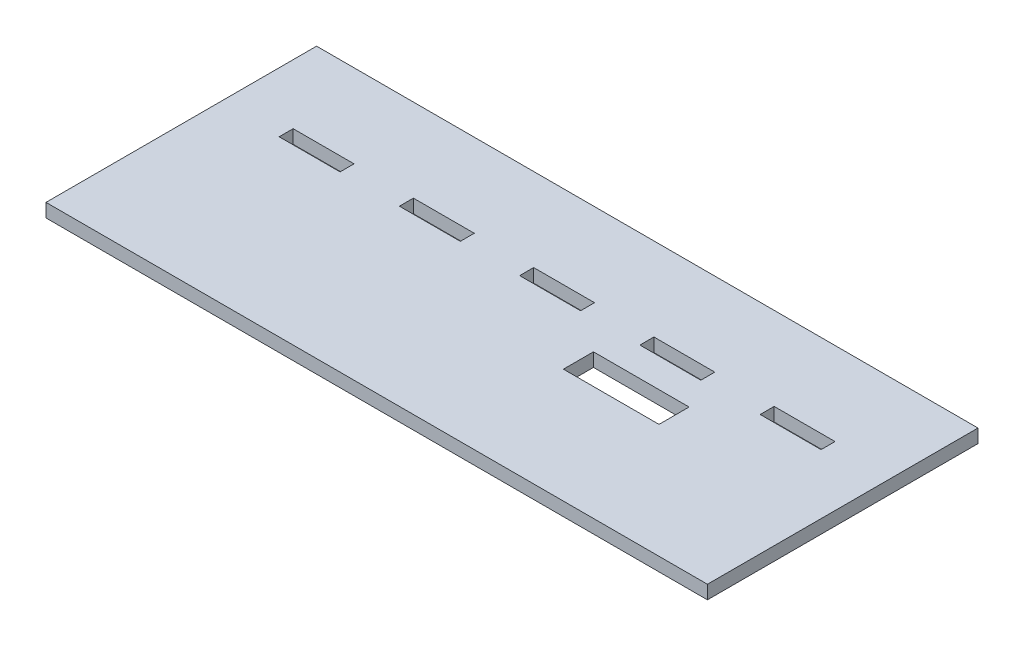
ISO-10303-21;
HEADER;
FILE_DESCRIPTION(('STEP AP214'),'2;1');
FILE_NAME('part.step','',(''),(''),'','','');
FILE_SCHEMA(('AUTOMOTIVE_DESIGN { 1 0 10303 214 1 1 1 1 }'));
ENDSEC;
DATA;
#1=APPLICATION_CONTEXT('core data for automotive mechanical design processes');
#2=APPLICATION_PROTOCOL_DEFINITION('international standard','automotive_design',2000,#1);
#3=PRODUCT_CONTEXT('',#1,'mechanical');
#4=PRODUCT('Part','Part','',(#3));
#5=PRODUCT_RELATED_PRODUCT_CATEGORY('part','',(#4));
#6=PRODUCT_DEFINITION_FORMATION('','',#4);
#7=PRODUCT_DEFINITION_CONTEXT('part definition',#1,'design');
#8=PRODUCT_DEFINITION('design','',#6,#7);
#9=PRODUCT_DEFINITION_SHAPE('','',#8);
#10=(LENGTH_UNIT() NAMED_UNIT(*) SI_UNIT(.MILLI.,.METRE.));
#11=(NAMED_UNIT(*) PLANE_ANGLE_UNIT() SI_UNIT($,.RADIAN.));
#12=(NAMED_UNIT(*) SI_UNIT($,.STERADIAN.) SOLID_ANGLE_UNIT());
#13=UNCERTAINTY_MEASURE_WITH_UNIT(LENGTH_MEASURE(1.E-05),#10,'distance_accuracy_value','');
#14=(GEOMETRIC_REPRESENTATION_CONTEXT(3) GLOBAL_UNCERTAINTY_ASSIGNED_CONTEXT((#13)) GLOBAL_UNIT_ASSIGNED_CONTEXT((#10,
#11,#12)) REPRESENTATION_CONTEXT('',''));
#15=CARTESIAN_POINT('',(0.,0.,0.));
#16=DIRECTION('',(0.,0.,1.));
#17=DIRECTION('',(1.,0.,0.));
#18=AXIS2_PLACEMENT_3D('',#15,#16,#17);
#19=CARTESIAN_POINT('',(-110.,4.5,-45.));
#20=DIRECTION('',(1.,0.,0.));
#21=DIRECTION('',(0.,0.,-1.));
#22=AXIS2_PLACEMENT_3D('',#19,#20,#21);
#23=PLANE('',#22);
#24=DIRECTION('',(0.,0.,1.));
#25=VECTOR('',#24,1.);
#26=CARTESIAN_POINT('',(-110.,0.,-45.));
#27=LINE('',#26,#25);
#28=CARTESIAN_POINT('',(-110.,0.,-45.));
#29=VERTEX_POINT('',#28);
#30=CARTESIAN_POINT('',(-110.,0.,45.));
#31=VERTEX_POINT('',#30);
#32=EDGE_CURVE('E416',#29,#31,#27,.T.);
#33=ORIENTED_EDGE('',*,*,#32,.T.);
#34=DIRECTION('',(0.,-1.,0.));
#35=VECTOR('',#34,1.);
#36=CARTESIAN_POINT('',(-110.,4.5,45.));
#37=LINE('',#36,#35);
#38=CARTESIAN_POINT('',(-110.,4.5,45.));
#39=VERTEX_POINT('',#38);
#40=EDGE_CURVE('E11',#39,#31,#37,.T.);
#41=ORIENTED_EDGE('',*,*,#40,.F.);
#42=DIRECTION('',(0.,0.,1.));
#43=VECTOR('',#42,1.);
#44=CARTESIAN_POINT('',(-110.,4.5,-45.));
#45=LINE('',#44,#43);
#46=CARTESIAN_POINT('',(-110.,4.5,-45.));
#47=VERTEX_POINT('',#46);
#48=EDGE_CURVE('E423',#47,#39,#45,.T.);
#49=ORIENTED_EDGE('',*,*,#48,.F.);
#50=DIRECTION('',(0.,-1.,0.));
#51=VECTOR('',#50,1.);
#52=CARTESIAN_POINT('',(-110.,4.5,-45.));
#53=LINE('',#52,#51);
#54=EDGE_CURVE('E433',#47,#29,#53,.T.);
#55=ORIENTED_EDGE('',*,*,#54,.T.);
#56=EDGE_LOOP('',(#33,#41,#49,#55));
#57=FACE_BOUND('',#56,.T.);
#58=ADVANCED_FACE('F42',(#57),#23,.F.);
#59=CARTESIAN_POINT('',(110.,4.5,45.));
#60=DIRECTION('',(0.,0.,-1.));
#61=DIRECTION('',(-1.,0.,0.));
#62=AXIS2_PLACEMENT_3D('',#59,#60,#61);
#63=PLANE('',#62);
#64=DIRECTION('',(1.,0.,0.));
#65=VECTOR('',#64,1.);
#66=CARTESIAN_POINT('',(110.,0.,45.));
#67=LINE('',#66,#65);
#68=CARTESIAN_POINT('',(110.,0.,45.));
#69=VERTEX_POINT('',#68);
#70=EDGE_CURVE('E436',#31,#69,#67,.T.);
#71=ORIENTED_EDGE('',*,*,#70,.T.);
#72=DIRECTION('',(0.,-1.,0.));
#73=VECTOR('',#72,1.);
#74=CARTESIAN_POINT('',(110.,4.5,45.));
#75=LINE('',#74,#73);
#76=CARTESIAN_POINT('',(110.,4.5,45.));
#77=VERTEX_POINT('',#76);
#78=EDGE_CURVE('E49',#77,#69,#75,.T.);
#79=ORIENTED_EDGE('',*,*,#78,.F.);
#80=DIRECTION('',(1.,0.,0.));
#81=VECTOR('',#80,1.);
#82=CARTESIAN_POINT('',(110.,4.5,45.));
#83=LINE('',#82,#81);
#84=EDGE_CURVE('E426',#39,#77,#83,.T.);
#85=ORIENTED_EDGE('',*,*,#84,.F.);
#86=ORIENTED_EDGE('',*,*,#40,.T.);
#87=EDGE_LOOP('',(#71,#79,#85,#86));
#88=FACE_BOUND('',#87,.T.);
#89=ADVANCED_FACE('F465',(#88),#63,.F.);
#90=CARTESIAN_POINT('',(110.,4.5,-45.));
#91=DIRECTION('',(-1.,0.,0.));
#92=DIRECTION('',(0.,0.,1.));
#93=AXIS2_PLACEMENT_3D('',#90,#91,#92);
#94=PLANE('',#93);
#95=DIRECTION('',(0.,0.,-1.));
#96=VECTOR('',#95,1.);
#97=CARTESIAN_POINT('',(110.,0.,-45.));
#98=LINE('',#97,#96);
#99=CARTESIAN_POINT('',(110.,0.,-45.));
#100=VERTEX_POINT('',#99);
#101=EDGE_CURVE('E438',#69,#100,#98,.T.);
#102=ORIENTED_EDGE('',*,*,#101,.T.);
#103=DIRECTION('',(0.,-1.,0.));
#104=VECTOR('',#103,1.);
#105=CARTESIAN_POINT('',(110.,4.5,-45.));
#106=LINE('',#105,#104);
#107=CARTESIAN_POINT('',(110.,4.5,-45.));
#108=VERTEX_POINT('',#107);
#109=EDGE_CURVE('E443',#108,#100,#106,.T.);
#110=ORIENTED_EDGE('',*,*,#109,.F.);
#111=DIRECTION('',(0.,0.,-1.));
#112=VECTOR('',#111,1.);
#113=CARTESIAN_POINT('',(110.,4.5,-45.));
#114=LINE('',#113,#112);
#115=EDGE_CURVE('E429',#77,#108,#114,.T.);
#116=ORIENTED_EDGE('',*,*,#115,.F.);
#117=ORIENTED_EDGE('',*,*,#78,.T.);
#118=EDGE_LOOP('',(#102,#110,#116,#117));
#119=FACE_BOUND('',#118,.T.);
#120=ADVANCED_FACE('F450',(#119),#94,.F.);
#121=CARTESIAN_POINT('',(110.,4.5,-45.));
#122=DIRECTION('',(0.,0.,1.));
#123=DIRECTION('',(1.,0.,0.));
#124=AXIS2_PLACEMENT_3D('',#121,#122,#123);
#125=PLANE('',#124);
#126=DIRECTION('',(-1.,0.,0.));
#127=VECTOR('',#126,1.);
#128=CARTESIAN_POINT('',(110.,0.,-45.));
#129=LINE('',#128,#127);
#130=EDGE_CURVE('E427',#100,#29,#129,.T.);
#131=ORIENTED_EDGE('',*,*,#130,.T.);
#132=ORIENTED_EDGE('',*,*,#54,.F.);
#133=DIRECTION('',(-1.,0.,0.));
#134=VECTOR('',#133,1.);
#135=CARTESIAN_POINT('',(110.,4.5,-45.));
#136=LINE('',#135,#134);
#137=EDGE_CURVE('E431',#108,#47,#136,.T.);
#138=ORIENTED_EDGE('',*,*,#137,.F.);
#139=ORIENTED_EDGE('',*,*,#109,.T.);
#140=EDGE_LOOP('',(#131,#132,#138,#139));
#141=FACE_BOUND('',#140,.T.);
#142=ADVANCED_FACE('F459',(#141),#125,.F.);
#143=CARTESIAN_POINT('',(0.,4.5,0.));
#144=DIRECTION('',(0.,-1.,0.));
#145=DIRECTION('',(0.,0.,-1.));
#146=AXIS2_PLACEMENT_3D('',#143,#144,#145);
#147=PLANE('',#146);
#148=DIRECTION('',(-1.,0.,0.));
#149=VECTOR('',#148,1.);
#150=CARTESIAN_POINT('',(55.9013875365791,4.5,7.));
#151=LINE('',#150,#149);
#152=CARTESIAN_POINT('',(55.9013875365791,4.5,7.));
#153=VERTEX_POINT('',#152);
#154=CARTESIAN_POINT('',(24.0986124634209,4.5,7.));
#155=VERTEX_POINT('',#154);
#156=EDGE_CURVE('E234',#153,#155,#151,.T.);
#157=ORIENTED_EDGE('',*,*,#156,.T.);
#158=DIRECTION('',(0.,0.,-1.));
#159=VECTOR('',#158,1.);
#160=CARTESIAN_POINT('',(24.0986124634209,4.5,7.));
#161=LINE('',#160,#159);
#162=CARTESIAN_POINT('',(24.0986124634209,4.5,-3.));
#163=VERTEX_POINT('',#162);
#164=EDGE_CURVE('E228',#155,#163,#161,.T.);
#165=ORIENTED_EDGE('',*,*,#164,.T.);
#166=DIRECTION('',(1.,0.,0.));
#167=VECTOR('',#166,1.);
#168=CARTESIAN_POINT('',(55.9013875365791,4.5,-3.));
#169=LINE('',#168,#167);
#170=CARTESIAN_POINT('',(55.9013875365791,4.5,-3.));
#171=VERTEX_POINT('',#170);
#172=EDGE_CURVE('E237',#163,#171,#169,.T.);
#173=ORIENTED_EDGE('',*,*,#172,.T.);
#174=DIRECTION('',(0.,0.,1.));
#175=VECTOR('',#174,1.);
#176=CARTESIAN_POINT('',(55.9013875365791,4.5,7.));
#177=LINE('',#176,#175);
#178=EDGE_CURVE('E56',#171,#153,#177,.T.);
#179=ORIENTED_EDGE('',*,*,#178,.T.);
#180=EDGE_LOOP('',(#157,#165,#173,#179));
#181=FACE_BOUND('',#180,.T.);
#182=DIRECTION('',(-1.,0.,0.));
#183=VECTOR('',#182,1.);
#184=CARTESIAN_POINT('',(-90.125,4.5,-12.675));
#185=LINE('',#184,#183);
#186=CARTESIAN_POINT('',(-69.875,4.5,-12.675));
#187=VERTEX_POINT('',#186);
#188=CARTESIAN_POINT('',(-90.125,4.5,-12.675));
#189=VERTEX_POINT('',#188);
#190=EDGE_CURVE('E330',#187,#189,#185,.T.);
#191=ORIENTED_EDGE('',*,*,#190,.T.);
#192=DIRECTION('',(0.,0.,-1.));
#193=VECTOR('',#192,1.);
#194=CARTESIAN_POINT('',(-90.125,4.5,-12.675));
#195=LINE('',#194,#193);
#196=CARTESIAN_POINT('',(-90.125,4.5,-17.325));
#197=VERTEX_POINT('',#196);
#198=EDGE_CURVE('E342',#189,#197,#195,.T.);
#199=ORIENTED_EDGE('',*,*,#198,.T.);
#200=DIRECTION('',(1.,0.,0.));
#201=VECTOR('',#200,1.);
#202=CARTESIAN_POINT('',(-90.125,4.5,-17.325));
#203=LINE('',#202,#201);
#204=CARTESIAN_POINT('',(-69.875,4.5,-17.325));
#205=VERTEX_POINT('',#204);
#206=EDGE_CURVE('E356',#197,#205,#203,.T.);
#207=ORIENTED_EDGE('',*,*,#206,.T.);
#208=DIRECTION('',(0.,0.,1.));
#209=VECTOR('',#208,1.);
#210=CARTESIAN_POINT('',(-69.875,4.5,-12.675));
#211=LINE('',#210,#209);
#212=EDGE_CURVE('E353',#205,#187,#211,.T.);
#213=ORIENTED_EDGE('',*,*,#212,.T.);
#214=EDGE_LOOP('',(#191,#199,#207,#213));
#215=FACE_BOUND('',#214,.T.);
#216=DIRECTION('',(0.,0.,-1.));
#217=VECTOR('',#216,1.);
#218=CARTESIAN_POINT('',(29.875,4.5,-12.675));
#219=LINE('',#218,#217);
#220=CARTESIAN_POINT('',(29.875,4.5,-12.675));
#221=VERTEX_POINT('',#220);
#222=CARTESIAN_POINT('',(29.875,4.5,-17.325));
#223=VERTEX_POINT('',#222);
#224=EDGE_CURVE('E364',#221,#223,#219,.T.);
#225=ORIENTED_EDGE('',*,*,#224,.T.);
#226=DIRECTION('',(1.,0.,0.));
#227=VECTOR('',#226,1.);
#228=CARTESIAN_POINT('',(50.125,4.5,-17.325));
#229=LINE('',#228,#227);
#230=CARTESIAN_POINT('',(50.125,4.5,-17.325));
#231=VERTEX_POINT('',#230);
#232=EDGE_CURVE('E374',#223,#231,#229,.T.);
#233=ORIENTED_EDGE('',*,*,#232,.T.);
#234=DIRECTION('',(0.,0.,1.));
#235=VECTOR('',#234,1.);
#236=CARTESIAN_POINT('',(50.125,4.5,-12.675));
#237=LINE('',#236,#235);
#238=CARTESIAN_POINT('',(50.125,4.5,-12.675));
#239=VERTEX_POINT('',#238);
#240=EDGE_CURVE('E386',#231,#239,#237,.T.);
#241=ORIENTED_EDGE('',*,*,#240,.T.);
#242=DIRECTION('',(-1.,0.,0.));
#243=VECTOR('',#242,1.);
#244=CARTESIAN_POINT('',(50.125,4.5,-12.675));
#245=LINE('',#244,#243);
#246=EDGE_CURVE('E383',#239,#221,#245,.T.);
#247=ORIENTED_EDGE('',*,*,#246,.T.);
#248=EDGE_LOOP('',(#225,#233,#241,#247));
#249=FACE_BOUND('',#248,.T.);
#250=DIRECTION('',(0.,0.,-1.));
#251=VECTOR('',#250,1.);
#252=CARTESIAN_POINT('',(69.875,4.5,-12.675));
#253=LINE('',#252,#251);
#254=CARTESIAN_POINT('',(69.875,4.5,-12.675));
#255=VERTEX_POINT('',#254);
#256=CARTESIAN_POINT('',(69.875,4.5,-17.325));
#257=VERTEX_POINT('',#256);
#258=EDGE_CURVE('E266',#255,#257,#253,.T.);
#259=ORIENTED_EDGE('',*,*,#258,.T.);
#260=DIRECTION('',(1.,0.,0.));
#261=VECTOR('',#260,1.);
#262=CARTESIAN_POINT('',(90.125,4.5,-17.325));
#263=LINE('',#262,#261);
#264=CARTESIAN_POINT('',(90.125,4.5,-17.325));
#265=VERTEX_POINT('',#264);
#266=EDGE_CURVE('E278',#257,#265,#263,.T.);
#267=ORIENTED_EDGE('',*,*,#266,.T.);
#268=DIRECTION('',(0.,0.,1.));
#269=VECTOR('',#268,1.);
#270=CARTESIAN_POINT('',(90.125,4.5,-12.675));
#271=LINE('',#270,#269);
#272=CARTESIAN_POINT('',(90.125,4.5,-12.675));
#273=VERTEX_POINT('',#272);
#274=EDGE_CURVE('E292',#265,#273,#271,.T.);
#275=ORIENTED_EDGE('',*,*,#274,.T.);
#276=DIRECTION('',(-1.,0.,0.));
#277=VECTOR('',#276,1.);
#278=CARTESIAN_POINT('',(90.125,4.5,-12.675));
#279=LINE('',#278,#277);
#280=EDGE_CURVE('E289',#273,#255,#279,.T.);
#281=ORIENTED_EDGE('',*,*,#280,.T.);
#282=EDGE_LOOP('',(#259,#267,#275,#281));
#283=FACE_BOUND('',#282,.T.);
#284=DIRECTION('',(-1.,0.,0.));
#285=VECTOR('',#284,1.);
#286=CARTESIAN_POINT('',(-50.125,4.5,-12.675));
#287=LINE('',#286,#285);
#288=CARTESIAN_POINT('',(-29.875,4.5,-12.675));
#289=VERTEX_POINT('',#288);
#290=CARTESIAN_POINT('',(-50.125,4.5,-12.675));
#291=VERTEX_POINT('',#290);
#292=EDGE_CURVE('E300',#289,#291,#287,.T.);
#293=ORIENTED_EDGE('',*,*,#292,.T.);
#294=DIRECTION('',(0.,0.,-1.));
#295=VECTOR('',#294,1.);
#296=CARTESIAN_POINT('',(-50.125,4.5,-12.675));
#297=LINE('',#296,#295);
#298=CARTESIAN_POINT('',(-50.125,4.5,-17.325));
#299=VERTEX_POINT('',#298);
#300=EDGE_CURVE('E310',#291,#299,#297,.T.);
#301=ORIENTED_EDGE('',*,*,#300,.T.);
#302=DIRECTION('',(1.,0.,0.));
#303=VECTOR('',#302,1.);
#304=CARTESIAN_POINT('',(-50.125,4.5,-17.325));
#305=LINE('',#304,#303);
#306=CARTESIAN_POINT('',(-29.875,4.5,-17.325));
#307=VERTEX_POINT('',#306);
#308=EDGE_CURVE('E322',#299,#307,#305,.T.);
#309=ORIENTED_EDGE('',*,*,#308,.T.);
#310=DIRECTION('',(0.,0.,1.));
#311=VECTOR('',#310,1.);
#312=CARTESIAN_POINT('',(-29.875,4.5,-12.675));
#313=LINE('',#312,#311);
#314=EDGE_CURVE('E319',#307,#289,#313,.T.);
#315=ORIENTED_EDGE('',*,*,#314,.T.);
#316=EDGE_LOOP('',(#293,#301,#309,#315));
#317=FACE_BOUND('',#316,.T.);
#318=DIRECTION('',(-1.,0.,0.));
#319=VECTOR('',#318,1.);
#320=CARTESIAN_POINT('',(10.125,4.5,-12.675));
#321=LINE('',#320,#319);
#322=CARTESIAN_POINT('',(10.125,4.5,-12.675));
#323=VERTEX_POINT('',#322);
#324=CARTESIAN_POINT('',(-10.125,4.5,-12.675));
#325=VERTEX_POINT('',#324);
#326=EDGE_CURVE('E401',#323,#325,#321,.T.);
#327=ORIENTED_EDGE('',*,*,#326,.T.);
#328=DIRECTION('',(0.,0.,-1.));
#329=VECTOR('',#328,1.);
#330=CARTESIAN_POINT('',(-10.125,4.5,-12.675));
#331=LINE('',#330,#329);
#332=CARTESIAN_POINT('',(-10.125,4.5,-17.325));
#333=VERTEX_POINT('',#332);
#334=EDGE_CURVE('E391',#325,#333,#331,.T.);
#335=ORIENTED_EDGE('',*,*,#334,.T.);
#336=DIRECTION('',(1.,0.,0.));
#337=VECTOR('',#336,1.);
#338=CARTESIAN_POINT('',(10.125,4.5,-17.325));
#339=LINE('',#338,#337);
#340=CARTESIAN_POINT('',(10.125,4.5,-17.325));
#341=VERTEX_POINT('',#340);
#342=EDGE_CURVE('E394',#333,#341,#339,.T.);
#343=ORIENTED_EDGE('',*,*,#342,.T.);
#344=DIRECTION('',(0.,0.,1.));
#345=VECTOR('',#344,1.);
#346=CARTESIAN_POINT('',(10.125,4.5,-12.675));
#347=LINE('',#346,#345);
#348=EDGE_CURVE('E398',#341,#323,#347,.T.);
#349=ORIENTED_EDGE('',*,*,#348,.T.);
#350=EDGE_LOOP('',(#327,#335,#343,#349));
#351=FACE_BOUND('',#350,.T.);
#352=ORIENTED_EDGE('',*,*,#48,.T.);
#353=ORIENTED_EDGE('',*,*,#84,.T.);
#354=ORIENTED_EDGE('',*,*,#115,.T.);
#355=ORIENTED_EDGE('',*,*,#137,.T.);
#356=EDGE_LOOP('',(#352,#353,#354,#355));
#357=FACE_BOUND('',#356,.T.);
#358=ADVANCED_FACE('F241',(#181,#215,#249,#283,#317,#351,#357),#147,.F.);
#359=CARTESIAN_POINT('',(0.,0.,0.));
#360=DIRECTION('',(0.,-1.,0.));
#361=DIRECTION('',(0.,0.,-1.));
#362=AXIS2_PLACEMENT_3D('',#359,#360,#361);
#363=PLANE('',#362);
#364=DIRECTION('',(0.,0.,-1.));
#365=VECTOR('',#364,1.);
#366=CARTESIAN_POINT('',(24.0986124634209,0.,7.));
#367=LINE('',#366,#365);
#368=CARTESIAN_POINT('',(24.0986124634209,0.,7.));
#369=VERTEX_POINT('',#368);
#370=CARTESIAN_POINT('',(24.0986124634209,0.,-3.));
#371=VERTEX_POINT('',#370);
#372=EDGE_CURVE('E64',#369,#371,#367,.T.);
#373=ORIENTED_EDGE('',*,*,#372,.F.);
#374=DIRECTION('',(-1.,0.,0.));
#375=VECTOR('',#374,1.);
#376=CARTESIAN_POINT('',(55.9013875365791,0.,7.));
#377=LINE('',#376,#375);
#378=CARTESIAN_POINT('',(55.9013875365791,0.,7.));
#379=VERTEX_POINT('',#378);
#380=EDGE_CURVE('E244',#379,#369,#377,.T.);
#381=ORIENTED_EDGE('',*,*,#380,.F.);
#382=DIRECTION('',(0.,0.,1.));
#383=VECTOR('',#382,1.);
#384=CARTESIAN_POINT('',(55.9013875365791,0.,7.));
#385=LINE('',#384,#383);
#386=CARTESIAN_POINT('',(55.9013875365791,0.,-3.));
#387=VERTEX_POINT('',#386);
#388=EDGE_CURVE('E247',#387,#379,#385,.T.);
#389=ORIENTED_EDGE('',*,*,#388,.F.);
#390=DIRECTION('',(1.,0.,0.));
#391=VECTOR('',#390,1.);
#392=CARTESIAN_POINT('',(55.9013875365791,0.,-3.));
#393=LINE('',#392,#391);
#394=EDGE_CURVE('E253',#371,#387,#393,.T.);
#395=ORIENTED_EDGE('',*,*,#394,.F.);
#396=EDGE_LOOP('',(#373,#381,#389,#395));
#397=FACE_BOUND('',#396,.T.);
#398=DIRECTION('',(0.,0.,-1.));
#399=VECTOR('',#398,1.);
#400=CARTESIAN_POINT('',(-90.125,0.,-12.675));
#401=LINE('',#400,#399);
#402=CARTESIAN_POINT('',(-90.125,0.,-12.675));
#403=VERTEX_POINT('',#402);
#404=CARTESIAN_POINT('',(-90.125,0.,-17.325));
#405=VERTEX_POINT('',#404);
#406=EDGE_CURVE('E348',#403,#405,#401,.T.);
#407=ORIENTED_EDGE('',*,*,#406,.F.);
#408=DIRECTION('',(-1.,0.,0.));
#409=VECTOR('',#408,1.);
#410=CARTESIAN_POINT('',(-90.125,0.,-12.675));
#411=LINE('',#410,#409);
#412=CARTESIAN_POINT('',(-69.875,0.,-12.675));
#413=VERTEX_POINT('',#412);
#414=EDGE_CURVE('E338',#413,#403,#411,.T.);
#415=ORIENTED_EDGE('',*,*,#414,.F.);
#416=DIRECTION('',(0.,0.,1.));
#417=VECTOR('',#416,1.);
#418=CARTESIAN_POINT('',(-69.875,0.,-12.675));
#419=LINE('',#418,#417);
#420=CARTESIAN_POINT('',(-69.875,0.,-17.325));
#421=VERTEX_POINT('',#420);
#422=EDGE_CURVE('E341',#421,#413,#419,.T.);
#423=ORIENTED_EDGE('',*,*,#422,.F.);
#424=DIRECTION('',(1.,0.,0.));
#425=VECTOR('',#424,1.);
#426=CARTESIAN_POINT('',(-90.125,0.,-17.325));
#427=LINE('',#426,#425);
#428=EDGE_CURVE('E345',#405,#421,#427,.T.);
#429=ORIENTED_EDGE('',*,*,#428,.F.);
#430=EDGE_LOOP('',(#407,#415,#423,#429));
#431=FACE_BOUND('',#430,.T.);
#432=DIRECTION('',(1.,0.,0.));
#433=VECTOR('',#432,1.);
#434=CARTESIAN_POINT('',(50.125,0.,-17.325));
#435=LINE('',#434,#433);
#436=CARTESIAN_POINT('',(29.875,0.,-17.325));
#437=VERTEX_POINT('',#436);
#438=CARTESIAN_POINT('',(50.125,0.,-17.325));
#439=VERTEX_POINT('',#438);
#440=EDGE_CURVE('E337',#437,#439,#435,.T.);
#441=ORIENTED_EDGE('',*,*,#440,.F.);
#442=DIRECTION('',(0.,0.,-1.));
#443=VECTOR('',#442,1.);
#444=CARTESIAN_POINT('',(29.875,0.,-12.675));
#445=LINE('',#444,#443);
#446=CARTESIAN_POINT('',(29.875,0.,-12.675));
#447=VERTEX_POINT('',#446);
#448=EDGE_CURVE('E370',#447,#437,#445,.T.);
#449=ORIENTED_EDGE('',*,*,#448,.F.);
#450=DIRECTION('',(-1.,0.,0.));
#451=VECTOR('',#450,1.);
#452=CARTESIAN_POINT('',(50.125,0.,-12.675));
#453=LINE('',#452,#451);
#454=CARTESIAN_POINT('',(50.125,0.,-12.675));
#455=VERTEX_POINT('',#454);
#456=EDGE_CURVE('E373',#455,#447,#453,.T.);
#457=ORIENTED_EDGE('',*,*,#456,.F.);
#458=DIRECTION('',(0.,0.,1.));
#459=VECTOR('',#458,1.);
#460=CARTESIAN_POINT('',(50.125,0.,-12.675));
#461=LINE('',#460,#459);
#462=EDGE_CURVE('E377',#439,#455,#461,.T.);
#463=ORIENTED_EDGE('',*,*,#462,.F.);
#464=EDGE_LOOP('',(#441,#449,#457,#463));
#465=FACE_BOUND('',#464,.T.);
#466=DIRECTION('',(1.,0.,0.));
#467=VECTOR('',#466,1.);
#468=CARTESIAN_POINT('',(90.125,0.,-17.325));
#469=LINE('',#468,#467);
#470=CARTESIAN_POINT('',(69.875,0.,-17.325));
#471=VERTEX_POINT('',#470);
#472=CARTESIAN_POINT('',(90.125,0.,-17.325));
#473=VERTEX_POINT('',#472);
#474=EDGE_CURVE('E284',#471,#473,#469,.T.);
#475=ORIENTED_EDGE('',*,*,#474,.F.);
#476=DIRECTION('',(0.,0.,-1.));
#477=VECTOR('',#476,1.);
#478=CARTESIAN_POINT('',(69.875,0.,-12.675));
#479=LINE('',#478,#477);
#480=CARTESIAN_POINT('',(69.875,0.,-12.675));
#481=VERTEX_POINT('',#480);
#482=EDGE_CURVE('E274',#481,#471,#479,.T.);
#483=ORIENTED_EDGE('',*,*,#482,.F.);
#484=DIRECTION('',(-1.,0.,0.));
#485=VECTOR('',#484,1.);
#486=CARTESIAN_POINT('',(90.125,0.,-12.675));
#487=LINE('',#486,#485);
#488=CARTESIAN_POINT('',(90.125,0.,-12.675));
#489=VERTEX_POINT('',#488);
#490=EDGE_CURVE('E277',#489,#481,#487,.T.);
#491=ORIENTED_EDGE('',*,*,#490,.F.);
#492=DIRECTION('',(0.,0.,1.));
#493=VECTOR('',#492,1.);
#494=CARTESIAN_POINT('',(90.125,0.,-12.675));
#495=LINE('',#494,#493);
#496=EDGE_CURVE('E281',#473,#489,#495,.T.);
#497=ORIENTED_EDGE('',*,*,#496,.F.);
#498=EDGE_LOOP('',(#475,#483,#491,#497));
#499=FACE_BOUND('',#498,.T.);
#500=DIRECTION('',(0.,0.,-1.));
#501=VECTOR('',#500,1.);
#502=CARTESIAN_POINT('',(-50.125,0.,-12.675));
#503=LINE('',#502,#501);
#504=CARTESIAN_POINT('',(-50.125,0.,-12.675));
#505=VERTEX_POINT('',#504);
#506=CARTESIAN_POINT('',(-50.125,0.,-17.325));
#507=VERTEX_POINT('',#506);
#508=EDGE_CURVE('E273',#505,#507,#503,.T.);
#509=ORIENTED_EDGE('',*,*,#508,.F.);
#510=DIRECTION('',(-1.,0.,0.));
#511=VECTOR('',#510,1.);
#512=CARTESIAN_POINT('',(-50.125,0.,-12.675));
#513=LINE('',#512,#511);
#514=CARTESIAN_POINT('',(-29.875,0.,-12.675));
#515=VERTEX_POINT('',#514);
#516=EDGE_CURVE('E306',#515,#505,#513,.T.);
#517=ORIENTED_EDGE('',*,*,#516,.F.);
#518=DIRECTION('',(0.,0.,1.));
#519=VECTOR('',#518,1.);
#520=CARTESIAN_POINT('',(-29.875,0.,-12.675));
#521=LINE('',#520,#519);
#522=CARTESIAN_POINT('',(-29.875,0.,-17.325));
#523=VERTEX_POINT('',#522);
#524=EDGE_CURVE('E309',#523,#515,#521,.T.);
#525=ORIENTED_EDGE('',*,*,#524,.F.);
#526=DIRECTION('',(1.,0.,0.));
#527=VECTOR('',#526,1.);
#528=CARTESIAN_POINT('',(-50.125,0.,-17.325));
#529=LINE('',#528,#527);
#530=EDGE_CURVE('E313',#507,#523,#529,.T.);
#531=ORIENTED_EDGE('',*,*,#530,.F.);
#532=EDGE_LOOP('',(#509,#517,#525,#531));
#533=FACE_BOUND('',#532,.T.);
#534=DIRECTION('',(0.,0.,-1.));
#535=VECTOR('',#534,1.);
#536=CARTESIAN_POINT('',(-10.125,0.,-12.675));
#537=LINE('',#536,#535);
#538=CARTESIAN_POINT('',(-10.125,0.,-12.675));
#539=VERTEX_POINT('',#538);
#540=CARTESIAN_POINT('',(-10.125,0.,-17.325));
#541=VERTEX_POINT('',#540);
#542=EDGE_CURVE('E350',#539,#541,#537,.T.);
#543=ORIENTED_EDGE('',*,*,#542,.F.);
#544=DIRECTION('',(-1.,0.,0.));
#545=VECTOR('',#544,1.);
#546=CARTESIAN_POINT('',(10.125,0.,-12.675));
#547=LINE('',#546,#545);
#548=CARTESIAN_POINT('',(10.125,0.,-12.675));
#549=VERTEX_POINT('',#548);
#550=EDGE_CURVE('E395',#549,#539,#547,.T.);
#551=ORIENTED_EDGE('',*,*,#550,.F.);
#552=DIRECTION('',(0.,0.,1.));
#553=VECTOR('',#552,1.);
#554=CARTESIAN_POINT('',(10.125,0.,-12.675));
#555=LINE('',#554,#553);
#556=CARTESIAN_POINT('',(10.125,0.,-17.325));
#557=VERTEX_POINT('',#556);
#558=EDGE_CURVE('E409',#557,#549,#555,.T.);
#559=ORIENTED_EDGE('',*,*,#558,.F.);
#560=DIRECTION('',(1.,0.,0.));
#561=VECTOR('',#560,1.);
#562=CARTESIAN_POINT('',(10.125,0.,-17.325));
#563=LINE('',#562,#561);
#564=EDGE_CURVE('E406',#541,#557,#563,.T.);
#565=ORIENTED_EDGE('',*,*,#564,.F.);
#566=EDGE_LOOP('',(#543,#551,#559,#565));
#567=FACE_BOUND('',#566,.T.);
#568=ORIENTED_EDGE('',*,*,#32,.F.);
#569=ORIENTED_EDGE('',*,*,#130,.F.);
#570=ORIENTED_EDGE('',*,*,#101,.F.);
#571=ORIENTED_EDGE('',*,*,#70,.F.);
#572=EDGE_LOOP('',(#568,#569,#570,#571));
#573=FACE_BOUND('',#572,.T.);
#574=ADVANCED_FACE('F456',(#397,#431,#465,#499,#533,#567,#573),#363,.T.);
#575=CARTESIAN_POINT('',(-10.125,4.5,-12.675));
#576=DIRECTION('',(-1.,0.,0.));
#577=DIRECTION('',(0.,0.,1.));
#578=AXIS2_PLACEMENT_3D('',#575,#576,#577);
#579=PLANE('',#578);
#580=ORIENTED_EDGE('',*,*,#542,.T.);
#581=DIRECTION('',(0.,-1.,0.));
#582=VECTOR('',#581,1.);
#583=CARTESIAN_POINT('',(-10.125,4.5,-17.325));
#584=LINE('',#583,#582);
#585=EDGE_CURVE('E404',#333,#541,#584,.T.);
#586=ORIENTED_EDGE('',*,*,#585,.F.);
#587=ORIENTED_EDGE('',*,*,#334,.F.);
#588=DIRECTION('',(0.,-1.,0.));
#589=VECTOR('',#588,1.);
#590=CARTESIAN_POINT('',(-10.125,4.5,-12.675));
#591=LINE('',#590,#589);
#592=EDGE_CURVE('E414',#325,#539,#591,.T.);
#593=ORIENTED_EDGE('',*,*,#592,.T.);
#594=EDGE_LOOP('',(#580,#586,#587,#593));
#595=FACE_BOUND('',#594,.T.);
#596=ADVANCED_FACE('F477',(#595),#579,.F.);
#597=CARTESIAN_POINT('',(10.125,4.5,-12.675));
#598=DIRECTION('',(0.,0.,1.));
#599=DIRECTION('',(1.,0.,0.));
#600=AXIS2_PLACEMENT_3D('',#597,#598,#599);
#601=PLANE('',#600);
#602=ORIENTED_EDGE('',*,*,#550,.T.);
#603=ORIENTED_EDGE('',*,*,#592,.F.);
#604=ORIENTED_EDGE('',*,*,#326,.F.);
#605=DIRECTION('',(0.,-1.,0.));
#606=VECTOR('',#605,1.);
#607=CARTESIAN_POINT('',(10.125,4.5,-12.675));
#608=LINE('',#607,#606);
#609=EDGE_CURVE('E417',#323,#549,#608,.T.);
#610=ORIENTED_EDGE('',*,*,#609,.T.);
#611=EDGE_LOOP('',(#602,#603,#604,#610));
#612=FACE_BOUND('',#611,.T.);
#613=ADVANCED_FACE('F483',(#612),#601,.F.);
#614=CARTESIAN_POINT('',(10.125,4.5,-12.675));
#615=DIRECTION('',(1.,0.,0.));
#616=DIRECTION('',(0.,0.,-1.));
#617=AXIS2_PLACEMENT_3D('',#614,#615,#616);
#618=PLANE('',#617);
#619=ORIENTED_EDGE('',*,*,#558,.T.);
#620=ORIENTED_EDGE('',*,*,#609,.F.);
#621=ORIENTED_EDGE('',*,*,#348,.F.);
#622=DIRECTION('',(0.,-1.,0.));
#623=VECTOR('',#622,1.);
#624=CARTESIAN_POINT('',(10.125,4.5,-17.325));
#625=LINE('',#624,#623);
#626=EDGE_CURVE('E419',#341,#557,#625,.T.);
#627=ORIENTED_EDGE('',*,*,#626,.T.);
#628=EDGE_LOOP('',(#619,#620,#621,#627));
#629=FACE_BOUND('',#628,.T.);
#630=ADVANCED_FACE('F489',(#629),#618,.F.);
#631=CARTESIAN_POINT('',(10.125,4.5,-17.325));
#632=DIRECTION('',(0.,0.,-1.));
#633=DIRECTION('',(-1.,0.,0.));
#634=AXIS2_PLACEMENT_3D('',#631,#632,#633);
#635=PLANE('',#634);
#636=ORIENTED_EDGE('',*,*,#564,.T.);
#637=ORIENTED_EDGE('',*,*,#626,.F.);
#638=ORIENTED_EDGE('',*,*,#342,.F.);
#639=ORIENTED_EDGE('',*,*,#585,.T.);
#640=EDGE_LOOP('',(#636,#637,#638,#639));
#641=FACE_BOUND('',#640,.T.);
#642=ADVANCED_FACE('F485',(#641),#635,.F.);
#643=CARTESIAN_POINT('',(-50.125,4.5,-12.675));
#644=DIRECTION('',(-1.,0.,0.));
#645=DIRECTION('',(0.,0.,1.));
#646=AXIS2_PLACEMENT_3D('',#643,#644,#645);
#647=PLANE('',#646);
#648=ORIENTED_EDGE('',*,*,#508,.T.);
#649=DIRECTION('',(0.,-1.,0.));
#650=VECTOR('',#649,1.);
#651=CARTESIAN_POINT('',(-50.125,4.5,-17.325));
#652=LINE('',#651,#650);
#653=EDGE_CURVE('E297',#299,#507,#652,.T.);
#654=ORIENTED_EDGE('',*,*,#653,.F.);
#655=ORIENTED_EDGE('',*,*,#300,.F.);
#656=DIRECTION('',(0.,-1.,0.));
#657=VECTOR('',#656,1.);
#658=CARTESIAN_POINT('',(-50.125,4.5,-12.675));
#659=LINE('',#658,#657);
#660=EDGE_CURVE('E259',#291,#505,#659,.T.);
#661=ORIENTED_EDGE('',*,*,#660,.T.);
#662=EDGE_LOOP('',(#648,#654,#655,#661));
#663=FACE_BOUND('',#662,.T.);
#664=ADVANCED_FACE('F488',(#663),#647,.F.);
#665=CARTESIAN_POINT('',(-50.125,4.5,-12.675));
#666=DIRECTION('',(0.,0.,1.));
#667=DIRECTION('',(1.,0.,0.));
#668=AXIS2_PLACEMENT_3D('',#665,#666,#667);
#669=PLANE('',#668);
#670=ORIENTED_EDGE('',*,*,#516,.T.);
#671=ORIENTED_EDGE('',*,*,#660,.F.);
#672=ORIENTED_EDGE('',*,*,#292,.F.);
#673=DIRECTION('',(0.,-1.,0.));
#674=VECTOR('',#673,1.);
#675=CARTESIAN_POINT('',(-29.875,4.5,-12.675));
#676=LINE('',#675,#674);
#677=EDGE_CURVE('E303',#289,#515,#676,.T.);
#678=ORIENTED_EDGE('',*,*,#677,.T.);
#679=EDGE_LOOP('',(#670,#671,#672,#678));
#680=FACE_BOUND('',#679,.T.);
#681=ADVANCED_FACE('F530',(#680),#669,.F.);
#682=CARTESIAN_POINT('',(-29.875,4.5,-12.675));
#683=DIRECTION('',(1.,0.,0.));
#684=DIRECTION('',(0.,0.,-1.));
#685=AXIS2_PLACEMENT_3D('',#682,#683,#684);
#686=PLANE('',#685);
#687=ORIENTED_EDGE('',*,*,#524,.T.);
#688=ORIENTED_EDGE('',*,*,#677,.F.);
#689=ORIENTED_EDGE('',*,*,#314,.F.);
#690=DIRECTION('',(0.,-1.,0.));
#691=VECTOR('',#690,1.);
#692=CARTESIAN_POINT('',(-29.875,4.5,-17.325));
#693=LINE('',#692,#691);
#694=EDGE_CURVE('E301',#307,#523,#693,.T.);
#695=ORIENTED_EDGE('',*,*,#694,.T.);
#696=EDGE_LOOP('',(#687,#688,#689,#695));
#697=FACE_BOUND('',#696,.T.);
#698=ADVANCED_FACE('F533',(#697),#686,.F.);
#699=CARTESIAN_POINT('',(-50.125,4.5,-17.325));
#700=DIRECTION('',(0.,0.,-1.));
#701=DIRECTION('',(-1.,0.,0.));
#702=AXIS2_PLACEMENT_3D('',#699,#700,#701);
#703=PLANE('',#702);
#704=ORIENTED_EDGE('',*,*,#530,.T.);
#705=ORIENTED_EDGE('',*,*,#694,.F.);
#706=ORIENTED_EDGE('',*,*,#308,.F.);
#707=ORIENTED_EDGE('',*,*,#653,.T.);
#708=EDGE_LOOP('',(#704,#705,#706,#707));
#709=FACE_BOUND('',#708,.T.);
#710=ADVANCED_FACE('F537',(#709),#703,.F.);
#711=CARTESIAN_POINT('',(90.125,4.5,-17.325));
#712=DIRECTION('',(0.,0.,-1.));
#713=DIRECTION('',(-1.,0.,0.));
#714=AXIS2_PLACEMENT_3D('',#711,#712,#713);
#715=PLANE('',#714);
#716=ORIENTED_EDGE('',*,*,#474,.T.);
#717=DIRECTION('',(0.,-1.,0.));
#718=VECTOR('',#717,1.);
#719=CARTESIAN_POINT('',(90.125,4.5,-17.325));
#720=LINE('',#719,#718);
#721=EDGE_CURVE('E263',#265,#473,#720,.T.);
#722=ORIENTED_EDGE('',*,*,#721,.F.);
#723=ORIENTED_EDGE('',*,*,#266,.F.);
#724=DIRECTION('',(0.,-1.,0.));
#725=VECTOR('',#724,1.);
#726=CARTESIAN_POINT('',(69.875,4.5,-17.325));
#727=LINE('',#726,#725);
#728=EDGE_CURVE('E271',#257,#471,#727,.T.);
#729=ORIENTED_EDGE('',*,*,#728,.T.);
#730=EDGE_LOOP('',(#716,#722,#723,#729));
#731=FACE_BOUND('',#730,.T.);
#732=ADVANCED_FACE('F541',(#731),#715,.F.);
#733=CARTESIAN_POINT('',(69.875,4.5,-12.675));
#734=DIRECTION('',(-1.,0.,0.));
#735=DIRECTION('',(0.,0.,1.));
#736=AXIS2_PLACEMENT_3D('',#733,#734,#735);
#737=PLANE('',#736);
#738=ORIENTED_EDGE('',*,*,#482,.T.);
#739=ORIENTED_EDGE('',*,*,#728,.F.);
#740=ORIENTED_EDGE('',*,*,#258,.F.);
#741=DIRECTION('',(0.,-1.,0.));
#742=VECTOR('',#741,1.);
#743=CARTESIAN_POINT('',(69.875,4.5,-12.675));
#744=LINE('',#743,#742);
#745=EDGE_CURVE('E269',#255,#481,#744,.T.);
#746=ORIENTED_EDGE('',*,*,#745,.T.);
#747=EDGE_LOOP('',(#738,#739,#740,#746));
#748=FACE_BOUND('',#747,.T.);
#749=ADVANCED_FACE('F546',(#748),#737,.F.);
#750=CARTESIAN_POINT('',(90.125,4.5,-12.675));
#751=DIRECTION('',(0.,0.,1.));
#752=DIRECTION('',(1.,0.,0.));
#753=AXIS2_PLACEMENT_3D('',#750,#751,#752);
#754=PLANE('',#753);
#755=ORIENTED_EDGE('',*,*,#490,.T.);
#756=ORIENTED_EDGE('',*,*,#745,.F.);
#757=ORIENTED_EDGE('',*,*,#280,.F.);
#758=DIRECTION('',(0.,-1.,0.));
#759=VECTOR('',#758,1.);
#760=CARTESIAN_POINT('',(90.125,4.5,-12.675));
#761=LINE('',#760,#759);
#762=EDGE_CURVE('E267',#273,#489,#761,.T.);
#763=ORIENTED_EDGE('',*,*,#762,.T.);
#764=EDGE_LOOP('',(#755,#756,#757,#763));
#765=FACE_BOUND('',#764,.T.);
#766=ADVANCED_FACE('F549',(#765),#754,.F.);
#767=CARTESIAN_POINT('',(90.125,4.5,-12.675));
#768=DIRECTION('',(1.,0.,0.));
#769=DIRECTION('',(0.,0.,-1.));
#770=AXIS2_PLACEMENT_3D('',#767,#768,#769);
#771=PLANE('',#770);
#772=ORIENTED_EDGE('',*,*,#496,.T.);
#773=ORIENTED_EDGE('',*,*,#762,.F.);
#774=ORIENTED_EDGE('',*,*,#274,.F.);
#775=ORIENTED_EDGE('',*,*,#721,.T.);
#776=EDGE_LOOP('',(#772,#773,#774,#775));
#777=FACE_BOUND('',#776,.T.);
#778=ADVANCED_FACE('F513',(#777),#771,.F.);
#779=CARTESIAN_POINT('',(50.125,4.5,-17.325));
#780=DIRECTION('',(0.,0.,-1.));
#781=DIRECTION('',(-1.,0.,0.));
#782=AXIS2_PLACEMENT_3D('',#779,#780,#781);
#783=PLANE('',#782);
#784=ORIENTED_EDGE('',*,*,#440,.T.);
#785=DIRECTION('',(0.,-1.,0.));
#786=VECTOR('',#785,1.);
#787=CARTESIAN_POINT('',(50.125,4.5,-17.325));
#788=LINE('',#787,#786);
#789=EDGE_CURVE('E361',#231,#439,#788,.T.);
#790=ORIENTED_EDGE('',*,*,#789,.F.);
#791=ORIENTED_EDGE('',*,*,#232,.F.);
#792=DIRECTION('',(0.,-1.,0.));
#793=VECTOR('',#792,1.);
#794=CARTESIAN_POINT('',(29.875,4.5,-17.325));
#795=LINE('',#794,#793);
#796=EDGE_CURVE('E286',#223,#437,#795,.T.);
#797=ORIENTED_EDGE('',*,*,#796,.T.);
#798=EDGE_LOOP('',(#784,#790,#791,#797));
#799=FACE_BOUND('',#798,.T.);
#800=ADVANCED_FACE('F501',(#799),#783,.F.);
#801=CARTESIAN_POINT('',(29.875,4.5,-12.675));
#802=DIRECTION('',(-1.,0.,0.));
#803=DIRECTION('',(0.,0.,1.));
#804=AXIS2_PLACEMENT_3D('',#801,#802,#803);
#805=PLANE('',#804);
#806=ORIENTED_EDGE('',*,*,#448,.T.);
#807=ORIENTED_EDGE('',*,*,#796,.F.);
#808=ORIENTED_EDGE('',*,*,#224,.F.);
#809=DIRECTION('',(0.,-1.,0.));
#810=VECTOR('',#809,1.);
#811=CARTESIAN_POINT('',(29.875,4.5,-12.675));
#812=LINE('',#811,#810);
#813=EDGE_CURVE('E367',#221,#447,#812,.T.);
#814=ORIENTED_EDGE('',*,*,#813,.T.);
#815=EDGE_LOOP('',(#806,#807,#808,#814));
#816=FACE_BOUND('',#815,.T.);
#817=ADVANCED_FACE('F497',(#816),#805,.F.);
#818=CARTESIAN_POINT('',(50.125,4.5,-12.675));
#819=DIRECTION('',(0.,0.,1.));
#820=DIRECTION('',(1.,0.,0.));
#821=AXIS2_PLACEMENT_3D('',#818,#819,#820);
#822=PLANE('',#821);
#823=ORIENTED_EDGE('',*,*,#456,.T.);
#824=ORIENTED_EDGE('',*,*,#813,.F.);
#825=ORIENTED_EDGE('',*,*,#246,.F.);
#826=DIRECTION('',(0.,-1.,0.));
#827=VECTOR('',#826,1.);
#828=CARTESIAN_POINT('',(50.125,4.5,-12.675));
#829=LINE('',#828,#827);
#830=EDGE_CURVE('E365',#239,#455,#829,.T.);
#831=ORIENTED_EDGE('',*,*,#830,.T.);
#832=EDGE_LOOP('',(#823,#824,#825,#831));
#833=FACE_BOUND('',#832,.T.);
#834=ADVANCED_FACE('F500',(#833),#822,.F.);
#835=CARTESIAN_POINT('',(50.125,4.5,-12.675));
#836=DIRECTION('',(1.,0.,0.));
#837=DIRECTION('',(0.,0.,-1.));
#838=AXIS2_PLACEMENT_3D('',#835,#836,#837);
#839=PLANE('',#838);
#840=ORIENTED_EDGE('',*,*,#462,.T.);
#841=ORIENTED_EDGE('',*,*,#830,.F.);
#842=ORIENTED_EDGE('',*,*,#240,.F.);
#843=ORIENTED_EDGE('',*,*,#789,.T.);
#844=EDGE_LOOP('',(#840,#841,#842,#843));
#845=FACE_BOUND('',#844,.T.);
#846=ADVANCED_FACE('F505',(#845),#839,.F.);
#847=CARTESIAN_POINT('',(-90.125,4.5,-12.675));
#848=DIRECTION('',(-1.,0.,0.));
#849=DIRECTION('',(0.,0.,1.));
#850=AXIS2_PLACEMENT_3D('',#847,#848,#849);
#851=PLANE('',#850);
#852=ORIENTED_EDGE('',*,*,#406,.T.);
#853=DIRECTION('',(0.,-1.,0.));
#854=VECTOR('',#853,1.);
#855=CARTESIAN_POINT('',(-90.125,4.5,-17.325));
#856=LINE('',#855,#854);
#857=EDGE_CURVE('E327',#197,#405,#856,.T.);
#858=ORIENTED_EDGE('',*,*,#857,.F.);
#859=ORIENTED_EDGE('',*,*,#198,.F.);
#860=DIRECTION('',(0.,-1.,0.));
#861=VECTOR('',#860,1.);
#862=CARTESIAN_POINT('',(-90.125,4.5,-12.675));
#863=LINE('',#862,#861);
#864=EDGE_CURVE('E335',#189,#403,#863,.T.);
#865=ORIENTED_EDGE('',*,*,#864,.T.);
#866=EDGE_LOOP('',(#852,#858,#859,#865));
#867=FACE_BOUND('',#866,.T.);
#868=ADVANCED_FACE('F509',(#867),#851,.F.);
#869=CARTESIAN_POINT('',(-90.125,4.5,-12.675));
#870=DIRECTION('',(0.,0.,1.));
#871=DIRECTION('',(1.,0.,0.));
#872=AXIS2_PLACEMENT_3D('',#869,#870,#871);
#873=PLANE('',#872);
#874=ORIENTED_EDGE('',*,*,#414,.T.);
#875=ORIENTED_EDGE('',*,*,#864,.F.);
#876=ORIENTED_EDGE('',*,*,#190,.F.);
#877=DIRECTION('',(0.,-1.,0.));
#878=VECTOR('',#877,1.);
#879=CARTESIAN_POINT('',(-69.875,4.5,-12.675));
#880=LINE('',#879,#878);
#881=EDGE_CURVE('E333',#187,#413,#880,.T.);
#882=ORIENTED_EDGE('',*,*,#881,.T.);
#883=EDGE_LOOP('',(#874,#875,#876,#882));
#884=FACE_BOUND('',#883,.T.);
#885=ADVANCED_FACE('F515',(#884),#873,.F.);
#886=CARTESIAN_POINT('',(-69.875,4.5,-12.675));
#887=DIRECTION('',(1.,0.,0.));
#888=DIRECTION('',(0.,0.,-1.));
#889=AXIS2_PLACEMENT_3D('',#886,#887,#888);
#890=PLANE('',#889);
#891=ORIENTED_EDGE('',*,*,#422,.T.);
#892=ORIENTED_EDGE('',*,*,#881,.F.);
#893=ORIENTED_EDGE('',*,*,#212,.F.);
#894=DIRECTION('',(0.,-1.,0.));
#895=VECTOR('',#894,1.);
#896=CARTESIAN_POINT('',(-69.875,4.5,-17.325));
#897=LINE('',#896,#895);
#898=EDGE_CURVE('E331',#205,#421,#897,.T.);
#899=ORIENTED_EDGE('',*,*,#898,.T.);
#900=EDGE_LOOP('',(#891,#892,#893,#899));
#901=FACE_BOUND('',#900,.T.);
#902=ADVANCED_FACE('F518',(#901),#890,.F.);
#903=CARTESIAN_POINT('',(-90.125,4.5,-17.325));
#904=DIRECTION('',(0.,0.,-1.));
#905=DIRECTION('',(-1.,0.,0.));
#906=AXIS2_PLACEMENT_3D('',#903,#904,#905);
#907=PLANE('',#906);
#908=ORIENTED_EDGE('',*,*,#428,.T.);
#909=ORIENTED_EDGE('',*,*,#898,.F.);
#910=ORIENTED_EDGE('',*,*,#206,.F.);
#911=ORIENTED_EDGE('',*,*,#857,.T.);
#912=EDGE_LOOP('',(#908,#909,#910,#911));
#913=FACE_BOUND('',#912,.T.);
#914=ADVANCED_FACE('F522',(#913),#907,.F.);
#915=CARTESIAN_POINT('',(24.0986124634209,4.5,7.));
#916=DIRECTION('',(-1.,0.,0.));
#917=DIRECTION('',(0.,0.,1.));
#918=AXIS2_PLACEMENT_3D('',#915,#916,#917);
#919=PLANE('',#918);
#920=ORIENTED_EDGE('',*,*,#372,.T.);
#921=DIRECTION('',(0.,-1.,0.));
#922=VECTOR('',#921,1.);
#923=CARTESIAN_POINT('',(24.0986124634209,4.5,-3.));
#924=LINE('',#923,#922);
#925=EDGE_CURVE('E224',#163,#371,#924,.T.);
#926=ORIENTED_EDGE('',*,*,#925,.F.);
#927=ORIENTED_EDGE('',*,*,#164,.F.);
#928=DIRECTION('',(0.,-1.,0.));
#929=VECTOR('',#928,1.);
#930=CARTESIAN_POINT('',(24.0986124634209,4.5,7.));
#931=LINE('',#930,#929);
#932=EDGE_CURVE('E257',#155,#369,#931,.T.);
#933=ORIENTED_EDGE('',*,*,#932,.T.);
#934=EDGE_LOOP('',(#920,#926,#927,#933));
#935=FACE_BOUND('',#934,.T.);
#936=ADVANCED_FACE('F226',(#935),#919,.F.);
#937=CARTESIAN_POINT('',(55.9013875365791,4.5,7.));
#938=DIRECTION('',(0.,0.,1.));
#939=DIRECTION('',(1.,0.,0.));
#940=AXIS2_PLACEMENT_3D('',#937,#938,#939);
#941=PLANE('',#940);
#942=ORIENTED_EDGE('',*,*,#380,.T.);
#943=ORIENTED_EDGE('',*,*,#932,.F.);
#944=ORIENTED_EDGE('',*,*,#156,.F.);
#945=DIRECTION('',(0.,-1.,0.));
#946=VECTOR('',#945,1.);
#947=CARTESIAN_POINT('',(55.9013875365791,4.5,7.));
#948=LINE('',#947,#946);
#949=EDGE_CURVE('E260',#153,#379,#948,.T.);
#950=ORIENTED_EDGE('',*,*,#949,.T.);
#951=EDGE_LOOP('',(#942,#943,#944,#950));
#952=FACE_BOUND('',#951,.T.);
#953=ADVANCED_FACE('F562',(#952),#941,.F.);
#954=CARTESIAN_POINT('',(55.9013875365791,4.5,7.));
#955=DIRECTION('',(1.,0.,0.));
#956=DIRECTION('',(0.,0.,-1.));
#957=AXIS2_PLACEMENT_3D('',#954,#955,#956);
#958=PLANE('',#957);
#959=ORIENTED_EDGE('',*,*,#388,.T.);
#960=ORIENTED_EDGE('',*,*,#949,.F.);
#961=ORIENTED_EDGE('',*,*,#178,.F.);
#962=DIRECTION('',(0.,-1.,0.));
#963=VECTOR('',#962,1.);
#964=CARTESIAN_POINT('',(55.9013875365791,4.5,-3.));
#965=LINE('',#964,#963);
#966=EDGE_CURVE('E233',#171,#387,#965,.T.);
#967=ORIENTED_EDGE('',*,*,#966,.T.);
#968=EDGE_LOOP('',(#959,#960,#961,#967));
#969=FACE_BOUND('',#968,.T.);
#970=ADVANCED_FACE('F565',(#969),#958,.F.);
#971=CARTESIAN_POINT('',(55.9013875365791,4.5,-3.));
#972=DIRECTION('',(0.,0.,-1.));
#973=DIRECTION('',(-1.,0.,0.));
#974=AXIS2_PLACEMENT_3D('',#971,#972,#973);
#975=PLANE('',#974);
#976=ORIENTED_EDGE('',*,*,#394,.T.);
#977=ORIENTED_EDGE('',*,*,#966,.F.);
#978=ORIENTED_EDGE('',*,*,#172,.F.);
#979=ORIENTED_EDGE('',*,*,#925,.T.);
#980=EDGE_LOOP('',(#976,#977,#978,#979));
#981=FACE_BOUND('',#980,.T.);
#982=ADVANCED_FACE('F238',(#981),#975,.F.);
#983=CLOSED_SHELL('',(#58,#89,#120,#142,#358,#574,#596,#613,#630,#642,#664,#681,#698,#710,#732,
#749,#766,#778,#800,#817,#834,#846,#868,#885,#902,#914,#936,#953,#970,#982));
#984=MANIFOLD_SOLID_BREP('B2',#983);
#985=ADVANCED_BREP_SHAPE_REPRESENTATION('',(#18,#984),#14);
#986=SHAPE_DEFINITION_REPRESENTATION(#9,#985);
ENDSEC;
END-ISO-10303-21;
